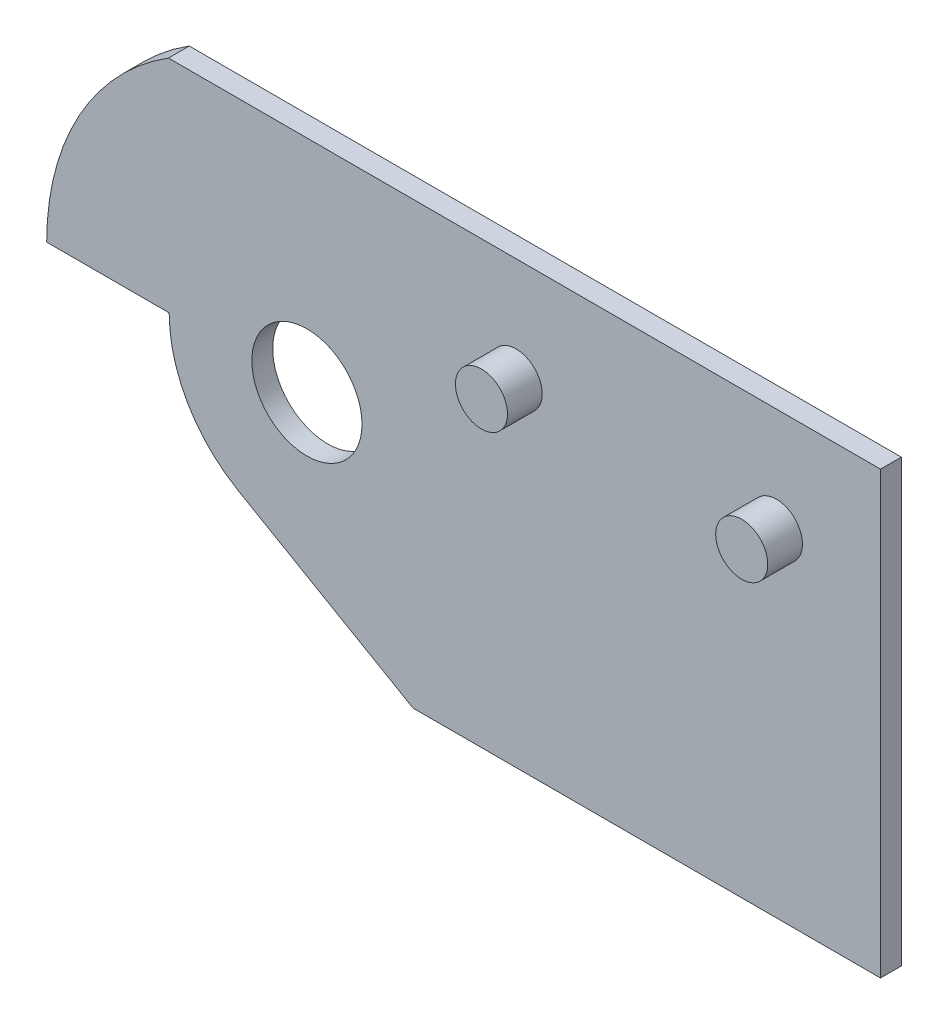
ISO-10303-21;
HEADER;
FILE_DESCRIPTION(('STEP AP214'),'2;1');
FILE_NAME('part.step','',(''),(''),'','','');
FILE_SCHEMA(('AUTOMOTIVE_DESIGN { 1 0 10303 214 1 1 1 1 }'));
ENDSEC;
DATA;
#1=APPLICATION_CONTEXT('core data for automotive mechanical design processes');
#2=APPLICATION_PROTOCOL_DEFINITION('international standard','automotive_design',2000,#1);
#3=PRODUCT_CONTEXT('',#1,'mechanical');
#4=PRODUCT('Part','Part','',(#3));
#5=PRODUCT_RELATED_PRODUCT_CATEGORY('part','',(#4));
#6=PRODUCT_DEFINITION_FORMATION('','',#4);
#7=PRODUCT_DEFINITION_CONTEXT('part definition',#1,'design');
#8=PRODUCT_DEFINITION('design','',#6,#7);
#9=PRODUCT_DEFINITION_SHAPE('','',#8);
#10=(LENGTH_UNIT() NAMED_UNIT(*) SI_UNIT(.MILLI.,.METRE.));
#11=(NAMED_UNIT(*) PLANE_ANGLE_UNIT() SI_UNIT($,.RADIAN.));
#12=(NAMED_UNIT(*) SI_UNIT($,.STERADIAN.) SOLID_ANGLE_UNIT());
#13=UNCERTAINTY_MEASURE_WITH_UNIT(LENGTH_MEASURE(1.E-05),#10,'distance_accuracy_value','');
#14=(GEOMETRIC_REPRESENTATION_CONTEXT(3) GLOBAL_UNCERTAINTY_ASSIGNED_CONTEXT((#13)) GLOBAL_UNIT_ASSIGNED_CONTEXT((#10,
#11,#12)) REPRESENTATION_CONTEXT('',''));
#15=CARTESIAN_POINT('',(0.,0.,0.));
#16=DIRECTION('',(0.,0.,1.));
#17=DIRECTION('',(1.,0.,0.));
#18=AXIS2_PLACEMENT_3D('',#15,#16,#17);
#19=CARTESIAN_POINT('',(-53.3127236179358,8.6769039082263,36.9863051625942));
#20=DIRECTION('',(0.,0.,-1.));
#21=DIRECTION('',(-1.,0.,0.));
#22=AXIS2_PLACEMENT_3D('',#19,#20,#21);
#23=PLANE('',#22);
#24=CARTESIAN_POINT('',(-26.2527236179358,15.3769039082263,36.9863051625942));
#25=DIRECTION('',(0.,0.,-1.));
#26=DIRECTION('',(-1.,0.,0.));
#27=AXIS2_PLACEMENT_3D('',#24,#25,#26);
#28=CIRCLE('',#27,1.5);
#29=CARTESIAN_POINT('',(-27.7527236179358,15.3769039082263,36.9863051625942));
#30=VERTEX_POINT('',#29);
#31=EDGE_CURVE('E11',#30,#30,#28,.F.);
#32=ORIENTED_EDGE('',*,*,#31,.F.);
#33=EDGE_LOOP('',(#32));
#34=FACE_BOUND('',#33,.T.);
#35=CARTESIAN_POINT('',(-41.2527236179358,15.3769039082263,36.9863051625942));
#36=DIRECTION('',(0.,0.,-1.));
#37=DIRECTION('',(-1.,0.,0.));
#38=AXIS2_PLACEMENT_3D('',#35,#36,#37);
#39=CIRCLE('',#38,1.5);
#40=CARTESIAN_POINT('',(-42.7527236179358,15.3769039082263,36.9863051625942));
#41=VERTEX_POINT('',#40);
#42=EDGE_CURVE('E41',#41,#41,#39,.F.);
#43=ORIENTED_EDGE('',*,*,#42,.F.);
#44=EDGE_LOOP('',(#43));
#45=FACE_BOUND('',#44,.T.);
#46=DIRECTION('',(-1.,0.,0.));
#47=VECTOR('',#46,1.);
#48=CARTESIAN_POINT('',(-47.1956783618109,21.3769039082263,36.9863051625942));
#49=LINE('',#48,#47);
#50=CARTESIAN_POINT('',(-20.2527236179358,21.3769039082263,36.9863051625942));
#51=VERTEX_POINT('',#50);
#52=CARTESIAN_POINT('',(-61.2945780390588,21.3769039082263,36.9863051625942));
#53=VERTEX_POINT('',#52);
#54=EDGE_CURVE('E49',#51,#53,#49,.T.);
#55=ORIENTED_EDGE('',*,*,#54,.T.);
#56=CARTESIAN_POINT('',(-53.3127236179358,8.6769039082263,36.9863051625942));
#57=DIRECTION('',(0.,0.,1.));
#58=DIRECTION('',(-1.,0.,0.));
#59=AXIS2_PLACEMENT_3D('',#56,#57,#58);
#60=CIRCLE('',#59,15.);
#61=CARTESIAN_POINT('',(-68.3127236179358,8.6769039082263,36.9863051625942));
#62=VERTEX_POINT('',#61);
#63=EDGE_CURVE('E91',#53,#62,#60,.T.);
#64=ORIENTED_EDGE('',*,*,#63,.T.);
#65=DIRECTION('',(1.,0.,0.));
#66=VECTOR('',#65,1.);
#67=CARTESIAN_POINT('',(-61.2527236179358,8.6769039082263,36.9863051625942));
#68=LINE('',#67,#66);
#69=CARTESIAN_POINT('',(-61.2527236179358,8.6769039082263,36.9863051625942));
#70=VERTEX_POINT('',#69);
#71=EDGE_CURVE('E196',#62,#70,#68,.T.);
#72=ORIENTED_EDGE('',*,*,#71,.T.);
#73=CARTESIAN_POINT('',(-53.3127236179358,8.6769039082263,36.9863051625942));
#74=DIRECTION('',(0.,0.,1.));
#75=DIRECTION('',(1.,0.,0.));
#76=AXIS2_PLACEMENT_3D('',#73,#74,#75);
#77=CIRCLE('',#76,7.94000000000001);
#78=CARTESIAN_POINT('',(-57.2827239432071,1.80066238997333,36.9863051625942));
#79=VERTEX_POINT('',#78);
#80=EDGE_CURVE('E108',#70,#79,#77,.T.);
#81=ORIENTED_EDGE('',*,*,#80,.T.);
#82=DIRECTION('',(0.866025403784442,-0.499999999999994,0.));
#83=VECTOR('',#82,1.);
#84=CARTESIAN_POINT('',(-47.1956783618109,-4.0230960917737,36.9863051625942));
#85=LINE('',#84,#83);
#86=CARTESIAN_POINT('',(-47.1956783618109,-4.0230960917737,36.9863051625942));
#87=VERTEX_POINT('',#86);
#88=EDGE_CURVE('E102',#79,#87,#85,.T.);
#89=ORIENTED_EDGE('',*,*,#88,.T.);
#90=DIRECTION('',(1.,0.,0.));
#91=VECTOR('',#90,1.);
#92=CARTESIAN_POINT('',(-20.2527236179358,-4.02309609177373,36.9863051625942));
#93=LINE('',#92,#91);
#94=CARTESIAN_POINT('',(-20.2527236179358,-4.02309609177373,36.9863051625942));
#95=VERTEX_POINT('',#94);
#96=EDGE_CURVE('E106',#87,#95,#93,.T.);
#97=ORIENTED_EDGE('',*,*,#96,.T.);
#98=DIRECTION('',(0.,1.,0.));
#99=VECTOR('',#98,1.);
#100=CARTESIAN_POINT('',(-20.2527236179358,-4.02309609177373,36.9863051625942));
#101=LINE('',#100,#99);
#102=EDGE_CURVE('E122',#95,#51,#101,.T.);
#103=ORIENTED_EDGE('',*,*,#102,.T.);
#104=EDGE_LOOP('',(#55,#64,#72,#81,#89,#97,#103));
#105=FACE_BOUND('',#104,.T.);
#106=CARTESIAN_POINT('',(-53.3127236179358,8.6769039082263,36.9863051625942));
#107=DIRECTION('',(0.,0.,1.));
#108=DIRECTION('',(1.,0.,0.));
#109=AXIS2_PLACEMENT_3D('',#106,#107,#108);
#110=CIRCLE('',#109,3.175);
#111=CARTESIAN_POINT('',(-50.1377236179358,8.6769039082263,36.9863051625942));
#112=VERTEX_POINT('',#111);
#113=EDGE_CURVE('E131',#112,#112,#110,.T.);
#114=ORIENTED_EDGE('',*,*,#113,.F.);
#115=EDGE_LOOP('',(#114));
#116=FACE_BOUND('',#115,.T.);
#117=ADVANCED_FACE('F32',(#34,#45,#105,#116),#23,.F.);
#118=CARTESIAN_POINT('',(-53.3127236179358,8.6769039082263,35.7863051625942));
#119=DIRECTION('',(0.,0.,-1.));
#120=DIRECTION('',(-1.,0.,0.));
#121=AXIS2_PLACEMENT_3D('',#118,#119,#120);
#122=PLANE('',#121);
#123=CARTESIAN_POINT('',(-53.3127236179358,8.6769039082263,35.7863051625942));
#124=DIRECTION('',(0.,0.,1.));
#125=DIRECTION('',(-1.,0.,0.));
#126=AXIS2_PLACEMENT_3D('',#123,#124,#125);
#127=CIRCLE('',#126,15.);
#128=CARTESIAN_POINT('',(-61.2945780390588,21.3769039082263,35.7863051625942));
#129=VERTEX_POINT('',#128);
#130=CARTESIAN_POINT('',(-68.3127236179358,8.6769039082263,35.7863051625942));
#131=VERTEX_POINT('',#130);
#132=EDGE_CURVE('E128',#129,#131,#127,.T.);
#133=ORIENTED_EDGE('',*,*,#132,.F.);
#134=DIRECTION('',(-1.,0.,0.));
#135=VECTOR('',#134,1.);
#136=CARTESIAN_POINT('',(-20.2527236179358,21.3769039082263,35.7863051625942));
#137=LINE('',#136,#135);
#138=CARTESIAN_POINT('',(-20.2527236179358,21.3769039082263,35.7863051625942));
#139=VERTEX_POINT('',#138);
#140=EDGE_CURVE('E138',#139,#129,#137,.T.);
#141=ORIENTED_EDGE('',*,*,#140,.F.);
#142=DIRECTION('',(0.,1.,0.));
#143=VECTOR('',#142,1.);
#144=CARTESIAN_POINT('',(-20.2527236179358,-4.02309609177373,35.7863051625942));
#145=LINE('',#144,#143);
#146=CARTESIAN_POINT('',(-20.2527236179358,-4.02309609177373,35.7863051625942));
#147=VERTEX_POINT('',#146);
#148=EDGE_CURVE('E83',#147,#139,#145,.T.);
#149=ORIENTED_EDGE('',*,*,#148,.F.);
#150=DIRECTION('',(1.,0.,0.));
#151=VECTOR('',#150,1.);
#152=CARTESIAN_POINT('',(-20.2527236179358,-4.02309609177373,35.7863051625942));
#153=LINE('',#152,#151);
#154=CARTESIAN_POINT('',(-47.1956783618109,-4.0230960917737,35.7863051625942));
#155=VERTEX_POINT('',#154);
#156=EDGE_CURVE('E76',#155,#147,#153,.T.);
#157=ORIENTED_EDGE('',*,*,#156,.F.);
#158=DIRECTION('',(0.866025403784442,-0.499999999999994,0.));
#159=VECTOR('',#158,1.);
#160=CARTESIAN_POINT('',(-47.1956783618109,-4.0230960917737,35.7863051625942));
#161=LINE('',#160,#159);
#162=CARTESIAN_POINT('',(-57.2827239432071,1.80066238997333,35.7863051625942));
#163=VERTEX_POINT('',#162);
#164=EDGE_CURVE('E116',#163,#155,#161,.T.);
#165=ORIENTED_EDGE('',*,*,#164,.F.);
#166=CARTESIAN_POINT('',(-53.3127236179358,8.6769039082263,35.7863051625942));
#167=DIRECTION('',(0.,0.,1.));
#168=DIRECTION('',(1.,0.,0.));
#169=AXIS2_PLACEMENT_3D('',#166,#167,#168);
#170=CIRCLE('',#169,7.94000000000001);
#171=CARTESIAN_POINT('',(-61.2527236179358,8.6769039082263,35.7863051625942));
#172=VERTEX_POINT('',#171);
#173=EDGE_CURVE('E133',#172,#163,#170,.T.);
#174=ORIENTED_EDGE('',*,*,#173,.F.);
#175=DIRECTION('',(1.,0.,0.));
#176=VECTOR('',#175,1.);
#177=CARTESIAN_POINT('',(-61.2527236179358,8.6769039082263,35.7863051625942));
#178=LINE('',#177,#176);
#179=EDGE_CURVE('E130',#131,#172,#178,.T.);
#180=ORIENTED_EDGE('',*,*,#179,.F.);
#181=EDGE_LOOP('',(#133,#141,#149,#157,#165,#174,#180));
#182=FACE_BOUND('',#181,.T.);
#183=CARTESIAN_POINT('',(-53.3127236179358,8.6769039082263,35.7863051625942));
#184=DIRECTION('',(0.,0.,1.));
#185=DIRECTION('',(1.,0.,0.));
#186=AXIS2_PLACEMENT_3D('',#183,#184,#185);
#187=CIRCLE('',#186,3.175);
#188=CARTESIAN_POINT('',(-50.1377236179358,8.6769039082263,35.7863051625942));
#189=VERTEX_POINT('',#188);
#190=EDGE_CURVE('E199',#189,#189,#187,.T.);
#191=ORIENTED_EDGE('',*,*,#190,.T.);
#192=EDGE_LOOP('',(#191));
#193=FACE_BOUND('',#192,.T.);
#194=ADVANCED_FACE('F156',(#182,#193),#122,.T.);
#195=CARTESIAN_POINT('',(-53.3127236179358,8.6769039082263,36.9863051625942));
#196=DIRECTION('',(0.,0.,-1.));
#197=DIRECTION('',(-1.,0.,0.));
#198=AXIS2_PLACEMENT_3D('',#195,#196,#197);
#199=CYLINDRICAL_SURFACE('',#198,15.);
#200=ORIENTED_EDGE('',*,*,#132,.T.);
#201=DIRECTION('',(0.,0.,-1.));
#202=VECTOR('',#201,1.);
#203=CARTESIAN_POINT('',(-68.3127236179358,8.6769039082263,36.9863051625942));
#204=LINE('',#203,#202);
#205=EDGE_CURVE('E146',#62,#131,#204,.T.);
#206=ORIENTED_EDGE('',*,*,#205,.F.);
#207=ORIENTED_EDGE('',*,*,#63,.F.);
#208=DIRECTION('',(0.,0.,-1.));
#209=VECTOR('',#208,1.);
#210=CARTESIAN_POINT('',(-61.2945780390588,21.3769039082263,36.9863051625942));
#211=LINE('',#210,#209);
#212=EDGE_CURVE('E149',#53,#129,#211,.T.);
#213=ORIENTED_EDGE('',*,*,#212,.T.);
#214=EDGE_LOOP('',(#200,#206,#207,#213));
#215=FACE_BOUND('',#214,.T.);
#216=ADVANCED_FACE('F34',(#215),#199,.T.);
#217=CARTESIAN_POINT('',(-61.2527236179358,8.6769039082263,36.9863051625942));
#218=DIRECTION('',(0.,1.,0.));
#219=DIRECTION('',(0.,0.,1.));
#220=AXIS2_PLACEMENT_3D('',#217,#218,#219);
#221=PLANE('',#220);
#222=ORIENTED_EDGE('',*,*,#179,.T.);
#223=DIRECTION('',(0.,0.,-1.));
#224=VECTOR('',#223,1.);
#225=CARTESIAN_POINT('',(-61.2527236179358,8.6769039082263,36.9863051625942));
#226=LINE('',#225,#224);
#227=EDGE_CURVE('E143',#70,#172,#226,.T.);
#228=ORIENTED_EDGE('',*,*,#227,.F.);
#229=ORIENTED_EDGE('',*,*,#71,.F.);
#230=ORIENTED_EDGE('',*,*,#205,.T.);
#231=EDGE_LOOP('',(#222,#228,#229,#230));
#232=FACE_BOUND('',#231,.T.);
#233=ADVANCED_FACE('F181',(#232),#221,.F.);
#234=CARTESIAN_POINT('',(-53.3127236179358,8.6769039082263,36.9863051625942));
#235=DIRECTION('',(0.,0.,-1.));
#236=DIRECTION('',(-1.,0.,0.));
#237=AXIS2_PLACEMENT_3D('',#234,#235,#236);
#238=CYLINDRICAL_SURFACE('',#237,7.94000000000001);
#239=ORIENTED_EDGE('',*,*,#173,.T.);
#240=DIRECTION('',(0.,0.,-1.));
#241=VECTOR('',#240,1.);
#242=CARTESIAN_POINT('',(-57.2827239432071,1.80066238997333,36.9863051625942));
#243=LINE('',#242,#241);
#244=EDGE_CURVE('E117',#79,#163,#243,.T.);
#245=ORIENTED_EDGE('',*,*,#244,.F.);
#246=ORIENTED_EDGE('',*,*,#80,.F.);
#247=ORIENTED_EDGE('',*,*,#227,.T.);
#248=EDGE_LOOP('',(#239,#245,#246,#247));
#249=FACE_BOUND('',#248,.T.);
#250=ADVANCED_FACE('F179',(#249),#238,.T.);
#251=CARTESIAN_POINT('',(-47.1956783618109,-4.0230960917737,36.9863051625942));
#252=DIRECTION('',(0.499999999999994,0.866025403784442,0.));
#253=DIRECTION('',(-0.866025403784442,0.499999999999994,0.));
#254=AXIS2_PLACEMENT_3D('',#251,#252,#253);
#255=PLANE('',#254);
#256=ORIENTED_EDGE('',*,*,#164,.T.);
#257=DIRECTION('',(0.,0.,-1.));
#258=VECTOR('',#257,1.);
#259=CARTESIAN_POINT('',(-47.1956783618109,-4.0230960917737,36.9863051625942));
#260=LINE('',#259,#258);
#261=EDGE_CURVE('E113',#87,#155,#260,.T.);
#262=ORIENTED_EDGE('',*,*,#261,.F.);
#263=ORIENTED_EDGE('',*,*,#88,.F.);
#264=ORIENTED_EDGE('',*,*,#244,.T.);
#265=EDGE_LOOP('',(#256,#262,#263,#264));
#266=FACE_BOUND('',#265,.T.);
#267=ADVANCED_FACE('F114',(#266),#255,.F.);
#268=CARTESIAN_POINT('',(-20.2527236179358,-4.02309609177373,36.9863051625942));
#269=DIRECTION('',(0.,1.,0.));
#270=DIRECTION('',(-1.,0.,0.));
#271=AXIS2_PLACEMENT_3D('',#268,#269,#270);
#272=PLANE('',#271);
#273=ORIENTED_EDGE('',*,*,#156,.T.);
#274=DIRECTION('',(0.,0.,-1.));
#275=VECTOR('',#274,1.);
#276=CARTESIAN_POINT('',(-20.2527236179358,-4.02309609177373,36.9863051625942));
#277=LINE('',#276,#275);
#278=EDGE_CURVE('E118',#95,#147,#277,.T.);
#279=ORIENTED_EDGE('',*,*,#278,.F.);
#280=ORIENTED_EDGE('',*,*,#96,.F.);
#281=ORIENTED_EDGE('',*,*,#261,.T.);
#282=EDGE_LOOP('',(#273,#279,#280,#281));
#283=FACE_BOUND('',#282,.T.);
#284=ADVANCED_FACE('F120',(#283),#272,.F.);
#285=CARTESIAN_POINT('',(-20.2527236179358,-4.02309609177373,36.9863051625942));
#286=DIRECTION('',(-1.,0.,0.));
#287=DIRECTION('',(0.,0.,1.));
#288=AXIS2_PLACEMENT_3D('',#285,#286,#287);
#289=PLANE('',#288);
#290=ORIENTED_EDGE('',*,*,#148,.T.);
#291=DIRECTION('',(0.,0.,-1.));
#292=VECTOR('',#291,1.);
#293=CARTESIAN_POINT('',(-20.2527236179358,21.3769039082263,36.9863051625942));
#294=LINE('',#293,#292);
#295=EDGE_CURVE('E124',#51,#139,#294,.T.);
#296=ORIENTED_EDGE('',*,*,#295,.F.);
#297=ORIENTED_EDGE('',*,*,#102,.F.);
#298=ORIENTED_EDGE('',*,*,#278,.T.);
#299=EDGE_LOOP('',(#290,#296,#297,#298));
#300=FACE_BOUND('',#299,.T.);
#301=ADVANCED_FACE('F172',(#300),#289,.F.);
#302=CARTESIAN_POINT('',(-20.2527236179358,21.3769039082263,36.9863051625942));
#303=DIRECTION('',(0.,-1.,0.));
#304=DIRECTION('',(1.,0.,0.));
#305=AXIS2_PLACEMENT_3D('',#302,#303,#304);
#306=PLANE('',#305);
#307=ORIENTED_EDGE('',*,*,#140,.T.);
#308=ORIENTED_EDGE('',*,*,#212,.F.);
#309=ORIENTED_EDGE('',*,*,#54,.F.);
#310=ORIENTED_EDGE('',*,*,#295,.T.);
#311=EDGE_LOOP('',(#307,#308,#309,#310));
#312=FACE_BOUND('',#311,.T.);
#313=ADVANCED_FACE('F169',(#312),#306,.F.);
#314=CARTESIAN_POINT('',(-53.3127236179358,8.6769039082263,36.9863051625942));
#315=DIRECTION('',(0.,0.,-1.));
#316=DIRECTION('',(-1.,0.,0.));
#317=AXIS2_PLACEMENT_3D('',#314,#315,#316);
#318=CYLINDRICAL_SURFACE('',#317,3.175);
#319=ORIENTED_EDGE('',*,*,#113,.T.);
#320=EDGE_LOOP('',(#319));
#321=FACE_BOUND('',#320,.T.);
#322=ORIENTED_EDGE('',*,*,#190,.F.);
#323=EDGE_LOOP('',(#322));
#324=FACE_BOUND('',#323,.T.);
#325=ADVANCED_FACE('F166',(#321,#324),#318,.F.);
#326=CARTESIAN_POINT('',(-41.2527236179358,15.3769039082263,38.9863051625942));
#327=DIRECTION('',(0.,0.,-1.));
#328=DIRECTION('',(-1.,0.,0.));
#329=AXIS2_PLACEMENT_3D('',#326,#327,#328);
#330=CYLINDRICAL_SURFACE('',#329,1.5);
#331=CARTESIAN_POINT('',(-41.2527236179358,15.3769039082263,38.9863051625942));
#332=DIRECTION('',(0.,0.,1.));
#333=DIRECTION('',(1.,0.,0.));
#334=AXIS2_PLACEMENT_3D('',#331,#332,#333);
#335=CIRCLE('',#334,1.5);
#336=CARTESIAN_POINT('',(-39.7527236179358,15.3769039082263,38.9863051625942));
#337=VERTEX_POINT('',#336);
#338=EDGE_CURVE('E203',#337,#337,#335,.T.);
#339=ORIENTED_EDGE('',*,*,#338,.F.);
#340=EDGE_LOOP('',(#339));
#341=FACE_BOUND('',#340,.T.);
#342=ORIENTED_EDGE('',*,*,#42,.T.);
#343=EDGE_LOOP('',(#342));
#344=FACE_BOUND('',#343,.T.);
#345=ADVANCED_FACE('F153',(#341,#344),#330,.T.);
#346=CARTESIAN_POINT('',(-41.2527236179358,15.3769039082263,38.9863051625942));
#347=DIRECTION('',(0.,0.,1.));
#348=DIRECTION('',(1.,0.,0.));
#349=AXIS2_PLACEMENT_3D('',#346,#347,#348);
#350=PLANE('',#349);
#351=ORIENTED_EDGE('',*,*,#338,.T.);
#352=EDGE_LOOP('',(#351));
#353=FACE_BOUND('',#352,.T.);
#354=ADVANCED_FACE('F217',(#353),#350,.T.);
#355=CARTESIAN_POINT('',(-26.2527236179358,15.3769039082263,38.9863051625942));
#356=DIRECTION('',(0.,0.,-1.));
#357=DIRECTION('',(-1.,0.,0.));
#358=AXIS2_PLACEMENT_3D('',#355,#356,#357);
#359=CYLINDRICAL_SURFACE('',#358,1.5);
#360=CARTESIAN_POINT('',(-26.2527236179358,15.3769039082263,38.9863051625942));
#361=DIRECTION('',(0.,0.,1.));
#362=DIRECTION('',(1.,0.,0.));
#363=AXIS2_PLACEMENT_3D('',#360,#361,#362);
#364=CIRCLE('',#363,1.5);
#365=CARTESIAN_POINT('',(-24.7527236179358,15.3769039082263,38.9863051625942));
#366=VERTEX_POINT('',#365);
#367=EDGE_CURVE('E208',#366,#366,#364,.T.);
#368=ORIENTED_EDGE('',*,*,#367,.F.);
#369=EDGE_LOOP('',(#368));
#370=FACE_BOUND('',#369,.T.);
#371=ORIENTED_EDGE('',*,*,#31,.T.);
#372=EDGE_LOOP('',(#371));
#373=FACE_BOUND('',#372,.T.);
#374=ADVANCED_FACE('F214',(#370,#373),#359,.T.);
#375=CARTESIAN_POINT('',(-26.2527236179358,15.3769039082263,38.9863051625942));
#376=DIRECTION('',(0.,0.,1.));
#377=DIRECTION('',(1.,0.,0.));
#378=AXIS2_PLACEMENT_3D('',#375,#376,#377);
#379=PLANE('',#378);
#380=ORIENTED_EDGE('',*,*,#367,.T.);
#381=EDGE_LOOP('',(#380));
#382=FACE_BOUND('',#381,.T.);
#383=ADVANCED_FACE('F212',(#382),#379,.T.);
#384=CLOSED_SHELL('',(#117,#194,#216,#233,#250,#267,#284,#301,#313,#325,#345,#354,#374,#383));
#385=MANIFOLD_SOLID_BREP('B2',#384);
#386=ADVANCED_BREP_SHAPE_REPRESENTATION('',(#18,#385),#14);
#387=SHAPE_DEFINITION_REPRESENTATION(#9,#386);
ENDSEC;
END-ISO-10303-21;
